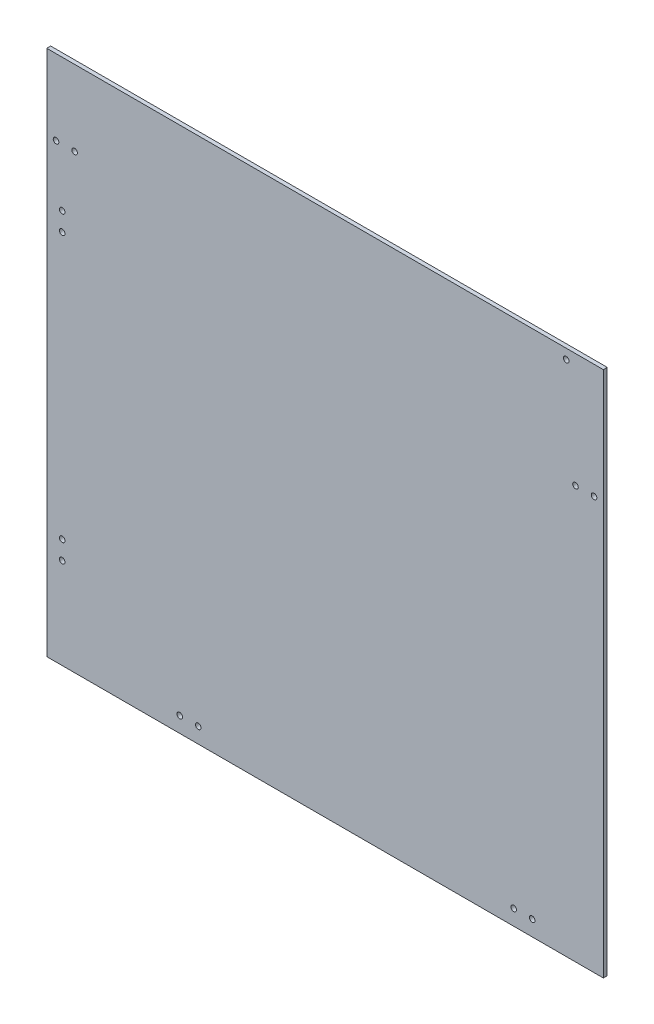
ISO-10303-21;
HEADER;
FILE_DESCRIPTION(('STEP AP214'),'2;1');
FILE_NAME('part.step','',(''),(''),'','','');
FILE_SCHEMA(('AUTOMOTIVE_DESIGN { 1 0 10303 214 1 1 1 1 }'));
ENDSEC;
DATA;
#1=APPLICATION_CONTEXT('core data for automotive mechanical design processes');
#2=APPLICATION_PROTOCOL_DEFINITION('international standard','automotive_design',2000,#1);
#3=PRODUCT_CONTEXT('',#1,'mechanical');
#4=PRODUCT('Part','Part','',(#3));
#5=PRODUCT_RELATED_PRODUCT_CATEGORY('part','',(#4));
#6=PRODUCT_DEFINITION_FORMATION('','',#4);
#7=PRODUCT_DEFINITION_CONTEXT('part definition',#1,'design');
#8=PRODUCT_DEFINITION('design','',#6,#7);
#9=PRODUCT_DEFINITION_SHAPE('','',#8);
#10=(LENGTH_UNIT() NAMED_UNIT(*) SI_UNIT(.MILLI.,.METRE.));
#11=(NAMED_UNIT(*) PLANE_ANGLE_UNIT() SI_UNIT($,.RADIAN.));
#12=(NAMED_UNIT(*) SI_UNIT($,.STERADIAN.) SOLID_ANGLE_UNIT());
#13=UNCERTAINTY_MEASURE_WITH_UNIT(LENGTH_MEASURE(1.E-05),#10,'distance_accuracy_value','');
#14=(GEOMETRIC_REPRESENTATION_CONTEXT(3) GLOBAL_UNCERTAINTY_ASSIGNED_CONTEXT((#13)) GLOBAL_UNIT_ASSIGNED_CONTEXT((#10,
#11,#12)) REPRESENTATION_CONTEXT('',''));
#15=CARTESIAN_POINT('',(0.,0.,0.));
#16=DIRECTION('',(0.,0.,1.));
#17=DIRECTION('',(1.,0.,0.));
#18=AXIS2_PLACEMENT_3D('',#15,#16,#17);
#19=CARTESIAN_POINT('',(0.,0.,3.175));
#20=DIRECTION('',(1.,0.,0.));
#21=DIRECTION('',(0.,0.,-1.));
#22=AXIS2_PLACEMENT_3D('',#19,#20,#21);
#23=PLANE('',#22);
#24=DIRECTION('',(0.,-1.,0.));
#25=VECTOR('',#24,1.);
#26=CARTESIAN_POINT('',(0.,0.,0.));
#27=LINE('',#26,#25);
#28=CARTESIAN_POINT('',(0.,426.,0.));
#29=VERTEX_POINT('',#28);
#30=CARTESIAN_POINT('',(0.,0.,0.));
#31=VERTEX_POINT('',#30);
#32=EDGE_CURVE('E96',#29,#31,#27,.T.);
#33=ORIENTED_EDGE('',*,*,#32,.T.);
#34=DIRECTION('',(0.,0.,-1.));
#35=VECTOR('',#34,1.);
#36=CARTESIAN_POINT('',(0.,0.,3.175));
#37=LINE('',#36,#35);
#38=CARTESIAN_POINT('',(0.,0.,3.175));
#39=VERTEX_POINT('',#38);
#40=EDGE_CURVE('E11',#39,#31,#37,.T.);
#41=ORIENTED_EDGE('',*,*,#40,.F.);
#42=DIRECTION('',(0.,-1.,0.));
#43=VECTOR('',#42,1.);
#44=CARTESIAN_POINT('',(0.,0.,3.175));
#45=LINE('',#44,#43);
#46=CARTESIAN_POINT('',(0.,426.,3.175));
#47=VERTEX_POINT('',#46);
#48=EDGE_CURVE('E84',#47,#39,#45,.T.);
#49=ORIENTED_EDGE('',*,*,#48,.F.);
#50=DIRECTION('',(0.,0.,-1.));
#51=VECTOR('',#50,1.);
#52=CARTESIAN_POINT('',(0.,426.,3.175));
#53=LINE('',#52,#51);
#54=EDGE_CURVE('E92',#47,#29,#53,.T.);
#55=ORIENTED_EDGE('',*,*,#54,.T.);
#56=EDGE_LOOP('',(#33,#41,#49,#55));
#57=FACE_BOUND('',#56,.T.);
#58=ADVANCED_FACE('F33',(#57),#23,.F.);
#59=CARTESIAN_POINT('',(0.,0.,3.175));
#60=DIRECTION('',(0.,1.,0.));
#61=DIRECTION('',(0.,0.,1.));
#62=AXIS2_PLACEMENT_3D('',#59,#60,#61);
#63=PLANE('',#62);
#64=DIRECTION('',(1.,0.,0.));
#65=VECTOR('',#64,1.);
#66=CARTESIAN_POINT('',(0.,0.,0.));
#67=LINE('',#66,#65);
#68=CARTESIAN_POINT('',(450.,0.,0.));
#69=VERTEX_POINT('',#68);
#70=EDGE_CURVE('E88',#31,#69,#67,.T.);
#71=ORIENTED_EDGE('',*,*,#70,.T.);
#72=DIRECTION('',(0.,0.,-1.));
#73=VECTOR('',#72,1.);
#74=CARTESIAN_POINT('',(450.,0.,3.175));
#75=LINE('',#74,#73);
#76=CARTESIAN_POINT('',(450.,0.,3.175));
#77=VERTEX_POINT('',#76);
#78=EDGE_CURVE('E41',#77,#69,#75,.T.);
#79=ORIENTED_EDGE('',*,*,#78,.F.);
#80=DIRECTION('',(1.,0.,0.));
#81=VECTOR('',#80,1.);
#82=CARTESIAN_POINT('',(0.,0.,3.175));
#83=LINE('',#82,#81);
#84=EDGE_CURVE('E79',#39,#77,#83,.T.);
#85=ORIENTED_EDGE('',*,*,#84,.F.);
#86=ORIENTED_EDGE('',*,*,#40,.T.);
#87=EDGE_LOOP('',(#71,#79,#85,#86));
#88=FACE_BOUND('',#87,.T.);
#89=ADVANCED_FACE('F87',(#88),#63,.F.);
#90=CARTESIAN_POINT('',(450.,0.,3.175));
#91=DIRECTION('',(-1.,0.,0.));
#92=DIRECTION('',(0.,0.,1.));
#93=AXIS2_PLACEMENT_3D('',#90,#91,#92);
#94=PLANE('',#93);
#95=DIRECTION('',(0.,1.,0.));
#96=VECTOR('',#95,1.);
#97=CARTESIAN_POINT('',(450.,0.,0.));
#98=LINE('',#97,#96);
#99=CARTESIAN_POINT('',(450.,426.,0.));
#100=VERTEX_POINT('',#99);
#101=EDGE_CURVE('E66',#69,#100,#98,.T.);
#102=ORIENTED_EDGE('',*,*,#101,.T.);
#103=DIRECTION('',(0.,0.,-1.));
#104=VECTOR('',#103,1.);
#105=CARTESIAN_POINT('',(450.,426.,3.175));
#106=LINE('',#105,#104);
#107=CARTESIAN_POINT('',(450.,426.,3.175));
#108=VERTEX_POINT('',#107);
#109=EDGE_CURVE('E89',#108,#100,#106,.T.);
#110=ORIENTED_EDGE('',*,*,#109,.F.);
#111=DIRECTION('',(0.,1.,0.));
#112=VECTOR('',#111,1.);
#113=CARTESIAN_POINT('',(450.,0.,3.175));
#114=LINE('',#113,#112);
#115=EDGE_CURVE('E82',#77,#108,#114,.T.);
#116=ORIENTED_EDGE('',*,*,#115,.F.);
#117=ORIENTED_EDGE('',*,*,#78,.T.);
#118=EDGE_LOOP('',(#102,#110,#116,#117));
#119=FACE_BOUND('',#118,.T.);
#120=ADVANCED_FACE('F90',(#119),#94,.F.);
#121=CARTESIAN_POINT('',(0.,426.,3.175));
#122=DIRECTION('',(0.,-1.,0.));
#123=DIRECTION('',(0.,0.,-1.));
#124=AXIS2_PLACEMENT_3D('',#121,#122,#123);
#125=PLANE('',#124);
#126=DIRECTION('',(-1.,0.,0.));
#127=VECTOR('',#126,1.);
#128=CARTESIAN_POINT('',(0.,426.,0.));
#129=LINE('',#128,#127);
#130=EDGE_CURVE('E72',#100,#29,#129,.T.);
#131=ORIENTED_EDGE('',*,*,#130,.T.);
#132=ORIENTED_EDGE('',*,*,#54,.F.);
#133=DIRECTION('',(-1.,0.,0.));
#134=VECTOR('',#133,1.);
#135=CARTESIAN_POINT('',(0.,426.,3.175));
#136=LINE('',#135,#134);
#137=EDGE_CURVE('E49',#108,#47,#136,.T.);
#138=ORIENTED_EDGE('',*,*,#137,.F.);
#139=ORIENTED_EDGE('',*,*,#109,.T.);
#140=EDGE_LOOP('',(#131,#132,#138,#139));
#141=FACE_BOUND('',#140,.T.);
#142=ADVANCED_FACE('F104',(#141),#125,.F.);
#143=CARTESIAN_POINT('',(0.,0.,3.175));
#144=DIRECTION('',(0.,0.,-1.));
#145=DIRECTION('',(-1.,0.,0.));
#146=AXIS2_PLACEMENT_3D('',#143,#144,#145);
#147=PLANE('',#146);
#148=CARTESIAN_POINT('',(12.5000000000013,318.5,3.175));
#149=DIRECTION('',(0.,0.,1.));
#150=DIRECTION('',(1.,0.,0.));
#151=AXIS2_PLACEMENT_3D('',#148,#149,#150);
#152=CIRCLE('',#151,2.25);
#153=CARTESIAN_POINT('',(14.7500000000013,318.5,3.175));
#154=VERTEX_POINT('',#153);
#155=EDGE_CURVE('E177',#154,#154,#152,.T.);
#156=ORIENTED_EDGE('',*,*,#155,.F.);
#157=EDGE_LOOP('',(#156));
#158=FACE_BOUND('',#157,.T.);
#159=CARTESIAN_POINT('',(12.5000000000013,73.4999999999988,3.175));
#160=DIRECTION('',(0.,0.,1.));
#161=DIRECTION('',(1.,0.,0.));
#162=AXIS2_PLACEMENT_3D('',#159,#160,#161);
#163=CIRCLE('',#162,2.25);
#164=CARTESIAN_POINT('',(14.7500000000013,73.4999999999988,3.175));
#165=VERTEX_POINT('',#164);
#166=EDGE_CURVE('E170',#165,#165,#163,.T.);
#167=ORIENTED_EDGE('',*,*,#166,.F.);
#168=EDGE_LOOP('',(#167));
#169=FACE_BOUND('',#168,.T.);
#170=CARTESIAN_POINT('',(12.5000000000013,88.4999999999988,3.175));
#171=DIRECTION('',(0.,0.,1.));
#172=DIRECTION('',(1.,0.,0.));
#173=AXIS2_PLACEMENT_3D('',#170,#171,#172);
#174=CIRCLE('',#173,2.25);
#175=CARTESIAN_POINT('',(14.7500000000013,88.4999999999988,3.175));
#176=VERTEX_POINT('',#175);
#177=EDGE_CURVE('E182',#176,#176,#174,.T.);
#178=ORIENTED_EDGE('',*,*,#177,.F.);
#179=EDGE_LOOP('',(#178));
#180=FACE_BOUND('',#179,.T.);
#181=CARTESIAN_POINT('',(12.5000000000013,303.5,3.175));
#182=DIRECTION('',(0.,0.,1.));
#183=DIRECTION('',(1.,0.,0.));
#184=AXIS2_PLACEMENT_3D('',#181,#182,#183);
#185=CIRCLE('',#184,2.25);
#186=CARTESIAN_POINT('',(14.7500000000013,303.5,3.175));
#187=VERTEX_POINT('',#186);
#188=EDGE_CURVE('E164',#187,#187,#185,.T.);
#189=ORIENTED_EDGE('',*,*,#188,.F.);
#190=EDGE_LOOP('',(#189));
#191=FACE_BOUND('',#190,.T.);
#192=CARTESIAN_POINT('',(392.5,12.4999999999996,3.175));
#193=DIRECTION('',(0.,0.,1.));
#194=DIRECTION('',(1.,0.,0.));
#195=AXIS2_PLACEMENT_3D('',#192,#193,#194);
#196=CIRCLE('',#195,2.24999999999995);
#197=CARTESIAN_POINT('',(394.75,12.4999999999996,3.175));
#198=VERTEX_POINT('',#197);
#199=EDGE_CURVE('E146',#198,#198,#196,.T.);
#200=ORIENTED_EDGE('',*,*,#199,.F.);
#201=EDGE_LOOP('',(#200));
#202=FACE_BOUND('',#201,.T.);
#203=CARTESIAN_POINT('',(107.5,12.4999999999996,3.175));
#204=DIRECTION('',(0.,0.,1.));
#205=DIRECTION('',(1.,0.,0.));
#206=AXIS2_PLACEMENT_3D('',#203,#204,#205);
#207=CIRCLE('',#206,2.25);
#208=CARTESIAN_POINT('',(109.75,12.4999999999996,3.175));
#209=VERTEX_POINT('',#208);
#210=EDGE_CURVE('E153',#209,#209,#207,.T.);
#211=ORIENTED_EDGE('',*,*,#210,.F.);
#212=EDGE_LOOP('',(#211));
#213=FACE_BOUND('',#212,.T.);
#214=CARTESIAN_POINT('',(122.5,12.4999999999996,3.175));
#215=DIRECTION('',(0.,0.,1.));
#216=DIRECTION('',(1.,0.,0.));
#217=AXIS2_PLACEMENT_3D('',#214,#215,#216);
#218=CIRCLE('',#217,2.25);
#219=CARTESIAN_POINT('',(124.75,12.4999999999996,3.175));
#220=VERTEX_POINT('',#219);
#221=EDGE_CURVE('E159',#220,#220,#218,.T.);
#222=ORIENTED_EDGE('',*,*,#221,.F.);
#223=EDGE_LOOP('',(#222));
#224=FACE_BOUND('',#223,.T.);
#225=CARTESIAN_POINT('',(377.5,12.4999999999996,3.175));
#226=DIRECTION('',(0.,0.,1.));
#227=DIRECTION('',(1.,0.,0.));
#228=AXIS2_PLACEMENT_3D('',#225,#226,#227);
#229=CIRCLE('',#228,2.24999999999995);
#230=CARTESIAN_POINT('',(379.75,12.4999999999996,3.175));
#231=VERTEX_POINT('',#230);
#232=EDGE_CURVE('E140',#231,#231,#229,.T.);
#233=ORIENTED_EDGE('',*,*,#232,.F.);
#234=EDGE_LOOP('',(#233));
#235=FACE_BOUND('',#234,.T.);
#236=CARTESIAN_POINT('',(7.50000000000075,365.054999999985,3.175));
#237=DIRECTION('',(0.,0.,1.));
#238=DIRECTION('',(1.,0.,0.));
#239=AXIS2_PLACEMENT_3D('',#236,#237,#238);
#240=CIRCLE('',#239,2.25);
#241=CARTESIAN_POINT('',(9.75000000000075,365.054999999985,3.175));
#242=VERTEX_POINT('',#241);
#243=EDGE_CURVE('E135',#242,#242,#240,.T.);
#244=ORIENTED_EDGE('',*,*,#243,.F.);
#245=EDGE_LOOP('',(#244));
#246=FACE_BOUND('',#245,.T.);
#247=CARTESIAN_POINT('',(22.5000000000007,365.054999999985,3.175));
#248=DIRECTION('',(0.,0.,1.));
#249=DIRECTION('',(1.,0.,0.));
#250=AXIS2_PLACEMENT_3D('',#247,#248,#249);
#251=CIRCLE('',#250,2.25);
#252=CARTESIAN_POINT('',(24.7500000000007,365.054999999985,3.175));
#253=VERTEX_POINT('',#252);
#254=EDGE_CURVE('E128',#253,#253,#251,.T.);
#255=ORIENTED_EDGE('',*,*,#254,.F.);
#256=EDGE_LOOP('',(#255));
#257=FACE_BOUND('',#256,.T.);
#258=CARTESIAN_POINT('',(427.5,333.5,3.175));
#259=DIRECTION('',(0.,0.,1.));
#260=DIRECTION('',(1.,0.,0.));
#261=AXIS2_PLACEMENT_3D('',#258,#259,#260);
#262=CIRCLE('',#261,2.24999999999996);
#263=CARTESIAN_POINT('',(429.75,333.5,3.175));
#264=VERTEX_POINT('',#263);
#265=EDGE_CURVE('E123',#264,#264,#262,.T.);
#266=ORIENTED_EDGE('',*,*,#265,.F.);
#267=EDGE_LOOP('',(#266));
#268=FACE_BOUND('',#267,.T.);
#269=CARTESIAN_POINT('',(442.5,333.5,3.175));
#270=DIRECTION('',(0.,0.,1.));
#271=DIRECTION('',(1.,0.,0.));
#272=AXIS2_PLACEMENT_3D('',#269,#270,#271);
#273=CIRCLE('',#272,2.24999999999996);
#274=CARTESIAN_POINT('',(444.75,333.5,3.175));
#275=VERTEX_POINT('',#274);
#276=EDGE_CURVE('E116',#275,#275,#273,.T.);
#277=ORIENTED_EDGE('',*,*,#276,.F.);
#278=EDGE_LOOP('',(#277));
#279=FACE_BOUND('',#278,.T.);
#280=CARTESIAN_POINT('',(420.,418.,3.175));
#281=DIRECTION('',(0.,0.,-1.));
#282=DIRECTION('',(-1.,0.,0.));
#283=AXIS2_PLACEMENT_3D('',#280,#281,#282);
#284=CIRCLE('',#283,2.24999999999996);
#285=CARTESIAN_POINT('',(417.75,418.,3.175));
#286=VERTEX_POINT('',#285);
#287=EDGE_CURVE('E99',#286,#286,#284,.T.);
#288=ORIENTED_EDGE('',*,*,#287,.T.);
#289=EDGE_LOOP('',(#288));
#290=FACE_BOUND('',#289,.T.);
#291=ORIENTED_EDGE('',*,*,#48,.T.);
#292=ORIENTED_EDGE('',*,*,#84,.T.);
#293=ORIENTED_EDGE('',*,*,#115,.T.);
#294=ORIENTED_EDGE('',*,*,#137,.T.);
#295=EDGE_LOOP('',(#291,#292,#293,#294));
#296=FACE_BOUND('',#295,.T.);
#297=ADVANCED_FACE('F80',(#158,#169,#180,#191,#202,#213,#224,#235,#246,#257,#268,#279,#290,
#296),#147,.F.);
#298=CARTESIAN_POINT('',(0.,0.,0.));
#299=DIRECTION('',(0.,0.,-1.));
#300=DIRECTION('',(-1.,0.,0.));
#301=AXIS2_PLACEMENT_3D('',#298,#299,#300);
#302=PLANE('',#301);
#303=CARTESIAN_POINT('',(12.5000000000013,318.5,0.));
#304=DIRECTION('',(0.,0.,1.));
#305=DIRECTION('',(1.,0.,0.));
#306=AXIS2_PLACEMENT_3D('',#303,#304,#305);
#307=CIRCLE('',#306,2.25);
#308=CARTESIAN_POINT('',(14.7500000000013,318.5,0.));
#309=VERTEX_POINT('',#308);
#310=EDGE_CURVE('E167',#309,#309,#307,.T.);
#311=ORIENTED_EDGE('',*,*,#310,.T.);
#312=EDGE_LOOP('',(#311));
#313=FACE_BOUND('',#312,.T.);
#314=CARTESIAN_POINT('',(12.5000000000013,73.4999999999988,0.));
#315=DIRECTION('',(0.,0.,1.));
#316=DIRECTION('',(1.,0.,0.));
#317=AXIS2_PLACEMENT_3D('',#314,#315,#316);
#318=CIRCLE('',#317,2.25);
#319=CARTESIAN_POINT('',(14.7500000000013,73.4999999999988,0.));
#320=VERTEX_POINT('',#319);
#321=EDGE_CURVE('E173',#320,#320,#318,.T.);
#322=ORIENTED_EDGE('',*,*,#321,.T.);
#323=EDGE_LOOP('',(#322));
#324=FACE_BOUND('',#323,.T.);
#325=CARTESIAN_POINT('',(12.5000000000013,88.4999999999988,0.));
#326=DIRECTION('',(0.,0.,1.));
#327=DIRECTION('',(1.,0.,0.));
#328=AXIS2_PLACEMENT_3D('',#325,#326,#327);
#329=CIRCLE('',#328,2.25);
#330=CARTESIAN_POINT('',(14.7500000000013,88.4999999999988,0.));
#331=VERTEX_POINT('',#330);
#332=EDGE_CURVE('E174',#331,#331,#329,.T.);
#333=ORIENTED_EDGE('',*,*,#332,.T.);
#334=EDGE_LOOP('',(#333));
#335=FACE_BOUND('',#334,.T.);
#336=CARTESIAN_POINT('',(12.5000000000013,303.5,0.));
#337=DIRECTION('',(0.,0.,1.));
#338=DIRECTION('',(1.,0.,0.));
#339=AXIS2_PLACEMENT_3D('',#336,#337,#338);
#340=CIRCLE('',#339,2.25);
#341=CARTESIAN_POINT('',(14.7500000000013,303.5,0.));
#342=VERTEX_POINT('',#341);
#343=EDGE_CURVE('E150',#342,#342,#340,.T.);
#344=ORIENTED_EDGE('',*,*,#343,.T.);
#345=EDGE_LOOP('',(#344));
#346=FACE_BOUND('',#345,.T.);
#347=CARTESIAN_POINT('',(392.5,12.4999999999996,0.));
#348=DIRECTION('',(0.,0.,1.));
#349=DIRECTION('',(1.,0.,0.));
#350=AXIS2_PLACEMENT_3D('',#347,#348,#349);
#351=CIRCLE('',#350,2.24999999999995);
#352=CARTESIAN_POINT('',(394.75,12.4999999999996,0.));
#353=VERTEX_POINT('',#352);
#354=EDGE_CURVE('E149',#353,#353,#351,.T.);
#355=ORIENTED_EDGE('',*,*,#354,.T.);
#356=EDGE_LOOP('',(#355));
#357=FACE_BOUND('',#356,.T.);
#358=CARTESIAN_POINT('',(107.5,12.4999999999996,0.));
#359=DIRECTION('',(0.,0.,1.));
#360=DIRECTION('',(1.,0.,0.));
#361=AXIS2_PLACEMENT_3D('',#358,#359,#360);
#362=CIRCLE('',#361,2.25);
#363=CARTESIAN_POINT('',(109.75,12.4999999999996,0.));
#364=VERTEX_POINT('',#363);
#365=EDGE_CURVE('E156',#364,#364,#362,.T.);
#366=ORIENTED_EDGE('',*,*,#365,.T.);
#367=EDGE_LOOP('',(#366));
#368=FACE_BOUND('',#367,.T.);
#369=CARTESIAN_POINT('',(122.5,12.4999999999996,0.));
#370=DIRECTION('',(0.,0.,1.));
#371=DIRECTION('',(1.,0.,0.));
#372=AXIS2_PLACEMENT_3D('',#369,#370,#371);
#373=CIRCLE('',#372,2.25);
#374=CARTESIAN_POINT('',(124.75,12.4999999999996,0.));
#375=VERTEX_POINT('',#374);
#376=EDGE_CURVE('E143',#375,#375,#373,.T.);
#377=ORIENTED_EDGE('',*,*,#376,.T.);
#378=EDGE_LOOP('',(#377));
#379=FACE_BOUND('',#378,.T.);
#380=CARTESIAN_POINT('',(377.5,12.4999999999996,0.));
#381=DIRECTION('',(0.,0.,1.));
#382=DIRECTION('',(1.,0.,0.));
#383=AXIS2_PLACEMENT_3D('',#380,#381,#382);
#384=CIRCLE('',#383,2.24999999999995);
#385=CARTESIAN_POINT('',(379.75,12.4999999999996,0.));
#386=VERTEX_POINT('',#385);
#387=EDGE_CURVE('E132',#386,#386,#384,.T.);
#388=ORIENTED_EDGE('',*,*,#387,.T.);
#389=EDGE_LOOP('',(#388));
#390=FACE_BOUND('',#389,.T.);
#391=CARTESIAN_POINT('',(7.50000000000075,365.054999999985,0.));
#392=DIRECTION('',(0.,0.,1.));
#393=DIRECTION('',(1.,0.,0.));
#394=AXIS2_PLACEMENT_3D('',#391,#392,#393);
#395=CIRCLE('',#394,2.25);
#396=CARTESIAN_POINT('',(9.75000000000075,365.054999999985,0.));
#397=VERTEX_POINT('',#396);
#398=EDGE_CURVE('E120',#397,#397,#395,.T.);
#399=ORIENTED_EDGE('',*,*,#398,.T.);
#400=EDGE_LOOP('',(#399));
#401=FACE_BOUND('',#400,.T.);
#402=CARTESIAN_POINT('',(22.5000000000007,365.054999999985,0.));
#403=DIRECTION('',(0.,0.,1.));
#404=DIRECTION('',(1.,0.,0.));
#405=AXIS2_PLACEMENT_3D('',#402,#403,#404);
#406=CIRCLE('',#405,2.25);
#407=CARTESIAN_POINT('',(24.7500000000007,365.054999999985,0.));
#408=VERTEX_POINT('',#407);
#409=EDGE_CURVE('E131',#408,#408,#406,.T.);
#410=ORIENTED_EDGE('',*,*,#409,.T.);
#411=EDGE_LOOP('',(#410));
#412=FACE_BOUND('',#411,.T.);
#413=CARTESIAN_POINT('',(427.5,333.5,0.));
#414=DIRECTION('',(0.,0.,1.));
#415=DIRECTION('',(1.,0.,0.));
#416=AXIS2_PLACEMENT_3D('',#413,#414,#415);
#417=CIRCLE('',#416,2.24999999999996);
#418=CARTESIAN_POINT('',(429.75,333.5,0.));
#419=VERTEX_POINT('',#418);
#420=EDGE_CURVE('E113',#419,#419,#417,.T.);
#421=ORIENTED_EDGE('',*,*,#420,.T.);
#422=EDGE_LOOP('',(#421));
#423=FACE_BOUND('',#422,.T.);
#424=CARTESIAN_POINT('',(442.5,333.5,0.));
#425=DIRECTION('',(0.,0.,1.));
#426=DIRECTION('',(1.,0.,0.));
#427=AXIS2_PLACEMENT_3D('',#424,#425,#426);
#428=CIRCLE('',#427,2.24999999999996);
#429=CARTESIAN_POINT('',(444.75,333.5,0.));
#430=VERTEX_POINT('',#429);
#431=EDGE_CURVE('E119',#430,#430,#428,.T.);
#432=ORIENTED_EDGE('',*,*,#431,.T.);
#433=EDGE_LOOP('',(#432));
#434=FACE_BOUND('',#433,.T.);
#435=CARTESIAN_POINT('',(420.,418.,0.));
#436=DIRECTION('',(0.,0.,-1.));
#437=DIRECTION('',(-1.,0.,0.));
#438=AXIS2_PLACEMENT_3D('',#435,#436,#437);
#439=CIRCLE('',#438,2.24999999999996);
#440=CARTESIAN_POINT('',(417.75,418.,0.));
#441=VERTEX_POINT('',#440);
#442=EDGE_CURVE('E110',#441,#441,#439,.T.);
#443=ORIENTED_EDGE('',*,*,#442,.F.);
#444=EDGE_LOOP('',(#443));
#445=FACE_BOUND('',#444,.T.);
#446=ORIENTED_EDGE('',*,*,#32,.F.);
#447=ORIENTED_EDGE('',*,*,#130,.F.);
#448=ORIENTED_EDGE('',*,*,#101,.F.);
#449=ORIENTED_EDGE('',*,*,#70,.F.);
#450=EDGE_LOOP('',(#446,#447,#448,#449));
#451=FACE_BOUND('',#450,.T.);
#452=ADVANCED_FACE('F107',(#313,#324,#335,#346,#357,#368,#379,#390,#401,#412,#423,#434,#445,
#451),#302,.T.);
#453=CARTESIAN_POINT('',(420.,418.,3.175));
#454=DIRECTION('',(0.,0.,-1.));
#455=DIRECTION('',(-1.,0.,0.));
#456=AXIS2_PLACEMENT_3D('',#453,#454,#455);
#457=CYLINDRICAL_SURFACE('',#456,2.24999999999996);
#458=ORIENTED_EDGE('',*,*,#287,.F.);
#459=EDGE_LOOP('',(#458));
#460=FACE_BOUND('',#459,.T.);
#461=ORIENTED_EDGE('',*,*,#442,.T.);
#462=EDGE_LOOP('',(#461));
#463=FACE_BOUND('',#462,.T.);
#464=ADVANCED_FACE('F222',(#460,#463),#457,.F.);
#465=CARTESIAN_POINT('',(442.5,333.5,0.));
#466=DIRECTION('',(0.,0.,1.));
#467=DIRECTION('',(1.,0.,0.));
#468=AXIS2_PLACEMENT_3D('',#465,#466,#467);
#469=CYLINDRICAL_SURFACE('',#468,2.24999999999996);
#470=ORIENTED_EDGE('',*,*,#431,.F.);
#471=EDGE_LOOP('',(#470));
#472=FACE_BOUND('',#471,.T.);
#473=ORIENTED_EDGE('',*,*,#276,.T.);
#474=EDGE_LOOP('',(#473));
#475=FACE_BOUND('',#474,.T.);
#476=ADVANCED_FACE('F225',(#472,#475),#469,.F.);
#477=CARTESIAN_POINT('',(427.5,333.5,0.));
#478=DIRECTION('',(0.,0.,1.));
#479=DIRECTION('',(1.,0.,0.));
#480=AXIS2_PLACEMENT_3D('',#477,#478,#479);
#481=CYLINDRICAL_SURFACE('',#480,2.24999999999996);
#482=ORIENTED_EDGE('',*,*,#420,.F.);
#483=EDGE_LOOP('',(#482));
#484=FACE_BOUND('',#483,.T.);
#485=ORIENTED_EDGE('',*,*,#265,.T.);
#486=EDGE_LOOP('',(#485));
#487=FACE_BOUND('',#486,.T.);
#488=ADVANCED_FACE('F327',(#484,#487),#481,.F.);
#489=CARTESIAN_POINT('',(22.5000000000007,365.054999999985,0.));
#490=DIRECTION('',(0.,0.,1.));
#491=DIRECTION('',(1.,0.,0.));
#492=AXIS2_PLACEMENT_3D('',#489,#490,#491);
#493=CYLINDRICAL_SURFACE('',#492,2.25);
#494=ORIENTED_EDGE('',*,*,#409,.F.);
#495=EDGE_LOOP('',(#494));
#496=FACE_BOUND('',#495,.T.);
#497=ORIENTED_EDGE('',*,*,#254,.T.);
#498=EDGE_LOOP('',(#497));
#499=FACE_BOUND('',#498,.T.);
#500=ADVANCED_FACE('F323',(#496,#499),#493,.F.);
#501=CARTESIAN_POINT('',(7.50000000000075,365.054999999985,0.));
#502=DIRECTION('',(0.,0.,1.));
#503=DIRECTION('',(1.,0.,0.));
#504=AXIS2_PLACEMENT_3D('',#501,#502,#503);
#505=CYLINDRICAL_SURFACE('',#504,2.25);
#506=ORIENTED_EDGE('',*,*,#398,.F.);
#507=EDGE_LOOP('',(#506));
#508=FACE_BOUND('',#507,.T.);
#509=ORIENTED_EDGE('',*,*,#243,.T.);
#510=EDGE_LOOP('',(#509));
#511=FACE_BOUND('',#510,.T.);
#512=ADVANCED_FACE('F319',(#508,#511),#505,.F.);
#513=CARTESIAN_POINT('',(377.5,12.4999999999996,0.));
#514=DIRECTION('',(0.,0.,1.));
#515=DIRECTION('',(1.,0.,0.));
#516=AXIS2_PLACEMENT_3D('',#513,#514,#515);
#517=CYLINDRICAL_SURFACE('',#516,2.24999999999995);
#518=ORIENTED_EDGE('',*,*,#387,.F.);
#519=EDGE_LOOP('',(#518));
#520=FACE_BOUND('',#519,.T.);
#521=ORIENTED_EDGE('',*,*,#232,.T.);
#522=EDGE_LOOP('',(#521));
#523=FACE_BOUND('',#522,.T.);
#524=ADVANCED_FACE('F310',(#520,#523),#517,.F.);
#525=CARTESIAN_POINT('',(122.5,12.4999999999996,0.));
#526=DIRECTION('',(0.,0.,1.));
#527=DIRECTION('',(1.,0.,0.));
#528=AXIS2_PLACEMENT_3D('',#525,#526,#527);
#529=CYLINDRICAL_SURFACE('',#528,2.25);
#530=ORIENTED_EDGE('',*,*,#376,.F.);
#531=EDGE_LOOP('',(#530));
#532=FACE_BOUND('',#531,.T.);
#533=ORIENTED_EDGE('',*,*,#221,.T.);
#534=EDGE_LOOP('',(#533));
#535=FACE_BOUND('',#534,.T.);
#536=ADVANCED_FACE('F306',(#532,#535),#529,.F.);
#537=CARTESIAN_POINT('',(107.5,12.4999999999996,0.));
#538=DIRECTION('',(0.,0.,1.));
#539=DIRECTION('',(1.,0.,0.));
#540=AXIS2_PLACEMENT_3D('',#537,#538,#539);
#541=CYLINDRICAL_SURFACE('',#540,2.25);
#542=ORIENTED_EDGE('',*,*,#365,.F.);
#543=EDGE_LOOP('',(#542));
#544=FACE_BOUND('',#543,.T.);
#545=ORIENTED_EDGE('',*,*,#210,.T.);
#546=EDGE_LOOP('',(#545));
#547=FACE_BOUND('',#546,.T.);
#548=ADVANCED_FACE('F309',(#544,#547),#541,.F.);
#549=CARTESIAN_POINT('',(392.5,12.4999999999996,0.));
#550=DIRECTION('',(0.,0.,1.));
#551=DIRECTION('',(1.,0.,0.));
#552=AXIS2_PLACEMENT_3D('',#549,#550,#551);
#553=CYLINDRICAL_SURFACE('',#552,2.24999999999995);
#554=ORIENTED_EDGE('',*,*,#354,.F.);
#555=EDGE_LOOP('',(#554));
#556=FACE_BOUND('',#555,.T.);
#557=ORIENTED_EDGE('',*,*,#199,.T.);
#558=EDGE_LOOP('',(#557));
#559=FACE_BOUND('',#558,.T.);
#560=ADVANCED_FACE('F260',(#556,#559),#553,.F.);
#561=CARTESIAN_POINT('',(12.5000000000013,303.5,0.));
#562=DIRECTION('',(0.,0.,1.));
#563=DIRECTION('',(1.,0.,0.));
#564=AXIS2_PLACEMENT_3D('',#561,#562,#563);
#565=CYLINDRICAL_SURFACE('',#564,2.25);
#566=ORIENTED_EDGE('',*,*,#343,.F.);
#567=EDGE_LOOP('',(#566));
#568=FACE_BOUND('',#567,.T.);
#569=ORIENTED_EDGE('',*,*,#188,.T.);
#570=EDGE_LOOP('',(#569));
#571=FACE_BOUND('',#570,.T.);
#572=ADVANCED_FACE('F194',(#568,#571),#565,.F.);
#573=CARTESIAN_POINT('',(12.5000000000013,88.4999999999988,0.));
#574=DIRECTION('',(0.,0.,1.));
#575=DIRECTION('',(1.,0.,0.));
#576=AXIS2_PLACEMENT_3D('',#573,#574,#575);
#577=CYLINDRICAL_SURFACE('',#576,2.25);
#578=ORIENTED_EDGE('',*,*,#332,.F.);
#579=EDGE_LOOP('',(#578));
#580=FACE_BOUND('',#579,.T.);
#581=ORIENTED_EDGE('',*,*,#177,.T.);
#582=EDGE_LOOP('',(#581));
#583=FACE_BOUND('',#582,.T.);
#584=ADVANCED_FACE('F190',(#580,#583),#577,.F.);
#585=CARTESIAN_POINT('',(12.5000000000013,73.4999999999988,0.));
#586=DIRECTION('',(0.,0.,1.));
#587=DIRECTION('',(1.,0.,0.));
#588=AXIS2_PLACEMENT_3D('',#585,#586,#587);
#589=CYLINDRICAL_SURFACE('',#588,2.25);
#590=ORIENTED_EDGE('',*,*,#321,.F.);
#591=EDGE_LOOP('',(#590));
#592=FACE_BOUND('',#591,.T.);
#593=ORIENTED_EDGE('',*,*,#166,.T.);
#594=EDGE_LOOP('',(#593));
#595=FACE_BOUND('',#594,.T.);
#596=ADVANCED_FACE('F193',(#592,#595),#589,.F.);
#597=CARTESIAN_POINT('',(12.5000000000013,318.5,0.));
#598=DIRECTION('',(0.,0.,1.));
#599=DIRECTION('',(1.,0.,0.));
#600=AXIS2_PLACEMENT_3D('',#597,#598,#599);
#601=CYLINDRICAL_SURFACE('',#600,2.25);
#602=ORIENTED_EDGE('',*,*,#310,.F.);
#603=EDGE_LOOP('',(#602));
#604=FACE_BOUND('',#603,.T.);
#605=ORIENTED_EDGE('',*,*,#155,.T.);
#606=EDGE_LOOP('',(#605));
#607=FACE_BOUND('',#606,.T.);
#608=ADVANCED_FACE('F289',(#604,#607),#601,.F.);
#609=CLOSED_SHELL('',(#58,#89,#120,#142,#297,#452,#464,#476,#488,#500,#512,#524,#536,#548,#560,
#572,#584,#596,#608));
#610=MANIFOLD_SOLID_BREP('B2',#609);
#611=ADVANCED_BREP_SHAPE_REPRESENTATION('',(#18,#610),#14);
#612=SHAPE_DEFINITION_REPRESENTATION(#9,#611);
ENDSEC;
END-ISO-10303-21;
